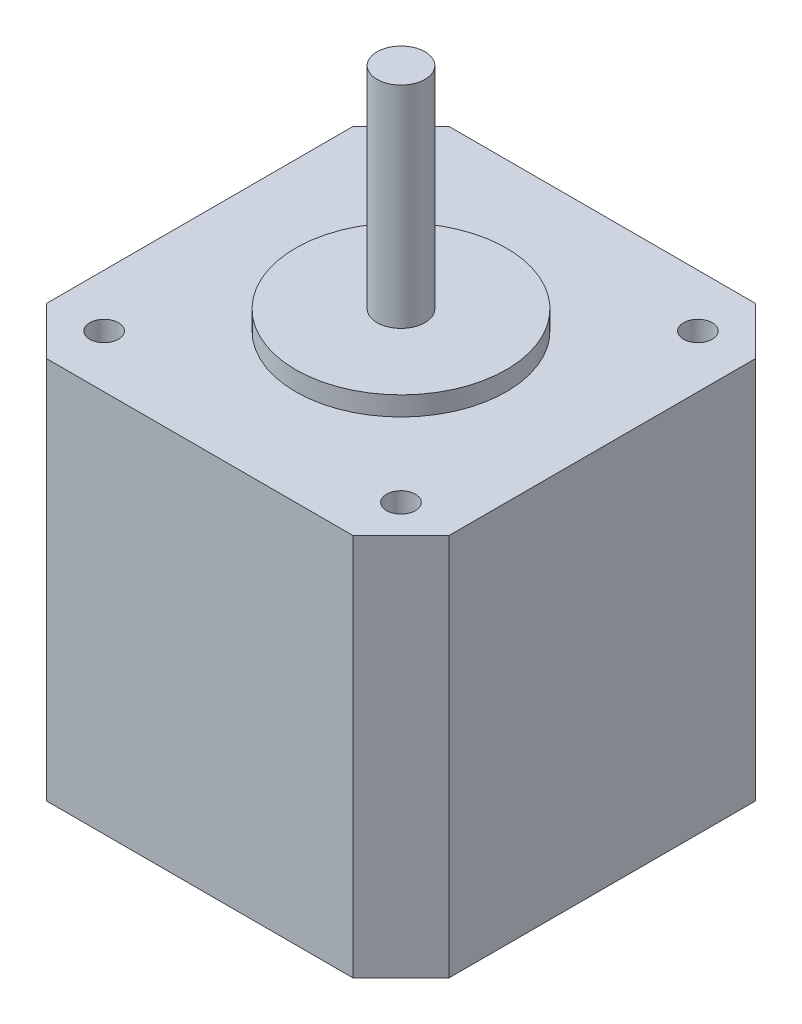
ISO-10303-21;
HEADER;
FILE_DESCRIPTION(('STEP AP214'),'2;1');
FILE_NAME('part.step','',(''),(''),'','','');
FILE_SCHEMA(('AUTOMOTIVE_DESIGN { 1 0 10303 214 1 1 1 1 }'));
ENDSEC;
DATA;
#1=APPLICATION_CONTEXT('core data for automotive mechanical design processes');
#2=APPLICATION_PROTOCOL_DEFINITION('international standard','automotive_design',2000,#1);
#3=PRODUCT_CONTEXT('',#1,'mechanical');
#4=PRODUCT('Part','Part','',(#3));
#5=PRODUCT_RELATED_PRODUCT_CATEGORY('part','',(#4));
#6=PRODUCT_DEFINITION_FORMATION('','',#4);
#7=PRODUCT_DEFINITION_CONTEXT('part definition',#1,'design');
#8=PRODUCT_DEFINITION('design','',#6,#7);
#9=PRODUCT_DEFINITION_SHAPE('','',#8);
#10=(LENGTH_UNIT() NAMED_UNIT(*) SI_UNIT(.MILLI.,.METRE.));
#11=(NAMED_UNIT(*) PLANE_ANGLE_UNIT() SI_UNIT($,.RADIAN.));
#12=(NAMED_UNIT(*) SI_UNIT($,.STERADIAN.) SOLID_ANGLE_UNIT());
#13=UNCERTAINTY_MEASURE_WITH_UNIT(LENGTH_MEASURE(1.E-05),#10,'distance_accuracy_value','');
#14=(GEOMETRIC_REPRESENTATION_CONTEXT(3) GLOBAL_UNCERTAINTY_ASSIGNED_CONTEXT((#13)) GLOBAL_UNIT_ASSIGNED_CONTEXT((#10,
#11,#12)) REPRESENTATION_CONTEXT('',''));
#15=CARTESIAN_POINT('',(0.,0.,0.));
#16=DIRECTION('',(0.,0.,1.));
#17=DIRECTION('',(1.,0.,0.));
#18=AXIS2_PLACEMENT_3D('',#15,#16,#17);
#19=CARTESIAN_POINT('',(-21.,40.,-21.));
#20=DIRECTION('',(1.,0.,0.));
#21=DIRECTION('',(0.,0.,-1.));
#22=AXIS2_PLACEMENT_3D('',#19,#20,#21);
#23=PLANE('',#22);
#24=DIRECTION('',(0.,-1.,0.));
#25=VECTOR('',#24,1.);
#26=CARTESIAN_POINT('',(-21.,2.11607597920603,-8.21099938016574));
#27=LINE('',#26,#25);
#28=CARTESIAN_POINT('',(-21.,2.11607597920603,-8.21099938016574));
#29=VERTEX_POINT('',#28);
#30=CARTESIAN_POINT('',(-21.,0.,-8.21099938016575));
#31=VERTEX_POINT('',#30);
#32=EDGE_CURVE('E57',#29,#31,#27,.T.);
#33=ORIENTED_EDGE('',*,*,#32,.F.);
#34=DIRECTION('',(0.,0.,-1.));
#35=VECTOR('',#34,1.);
#36=CARTESIAN_POINT('',(-21.,2.11607597920603,-8.21099938016574));
#37=LINE('',#36,#35);
#38=CARTESIAN_POINT('',(-21.,2.11607597920603,8.21099938016574));
#39=VERTEX_POINT('',#38);
#40=EDGE_CURVE('E153',#39,#29,#37,.T.);
#41=ORIENTED_EDGE('',*,*,#40,.F.);
#42=DIRECTION('',(0.,1.,0.));
#43=VECTOR('',#42,1.);
#44=CARTESIAN_POINT('',(-21.,2.11607597920603,8.21099938016574));
#45=LINE('',#44,#43);
#46=CARTESIAN_POINT('',(-21.,0.,8.21099938016574));
#47=VERTEX_POINT('',#46);
#48=EDGE_CURVE('E63',#47,#39,#45,.T.);
#49=ORIENTED_EDGE('',*,*,#48,.F.);
#50=DIRECTION('',(0.,0.,1.));
#51=VECTOR('',#50,1.);
#52=CARTESIAN_POINT('',(-21.,0.,-21.));
#53=LINE('',#52,#51);
#54=CARTESIAN_POINT('',(-21.,0.,16.));
#55=VERTEX_POINT('',#54);
#56=EDGE_CURVE('E237',#47,#55,#53,.T.);
#57=ORIENTED_EDGE('',*,*,#56,.T.);
#58=DIRECTION('',(0.,1.,0.));
#59=VECTOR('',#58,1.);
#60=CARTESIAN_POINT('',(-21.,40.,16.));
#61=LINE('',#60,#59);
#62=CARTESIAN_POINT('',(-21.,40.,16.));
#63=VERTEX_POINT('',#62);
#64=EDGE_CURVE('E267',#55,#63,#61,.T.);
#65=ORIENTED_EDGE('',*,*,#64,.T.);
#66=DIRECTION('',(0.,0.,1.));
#67=VECTOR('',#66,1.);
#68=CARTESIAN_POINT('',(-21.,40.,-21.));
#69=LINE('',#68,#67);
#70=CARTESIAN_POINT('',(-21.,40.,-16.));
#71=VERTEX_POINT('',#70);
#72=EDGE_CURVE('E223',#71,#63,#69,.T.);
#73=ORIENTED_EDGE('',*,*,#72,.F.);
#74=DIRECTION('',(0.,-1.,0.));
#75=VECTOR('',#74,1.);
#76=CARTESIAN_POINT('',(-21.,40.,-16.));
#77=LINE('',#76,#75);
#78=CARTESIAN_POINT('',(-21.,0.,-16.));
#79=VERTEX_POINT('',#78);
#80=EDGE_CURVE('E263',#71,#79,#77,.T.);
#81=ORIENTED_EDGE('',*,*,#80,.T.);
#82=EDGE_CURVE('E238',#79,#31,#53,.T.);
#83=ORIENTED_EDGE('',*,*,#82,.T.);
#84=EDGE_LOOP('',(#33,#41,#49,#57,#65,#73,#81,#83));
#85=FACE_BOUND('',#84,.T.);
#86=ADVANCED_FACE('F41',(#85),#23,.F.);
#87=CARTESIAN_POINT('',(21.,40.,-21.));
#88=DIRECTION('',(-1.,0.,0.));
#89=DIRECTION('',(0.,0.,1.));
#90=AXIS2_PLACEMENT_3D('',#87,#88,#89);
#91=PLANE('',#90);
#92=DIRECTION('',(0.,0.,-1.));
#93=VECTOR('',#92,1.);
#94=CARTESIAN_POINT('',(21.,40.,-21.));
#95=LINE('',#94,#93);
#96=CARTESIAN_POINT('',(21.,40.,16.));
#97=VERTEX_POINT('',#96);
#98=CARTESIAN_POINT('',(21.,40.,-16.));
#99=VERTEX_POINT('',#98);
#100=EDGE_CURVE('E214',#97,#99,#95,.T.);
#101=ORIENTED_EDGE('',*,*,#100,.F.);
#102=DIRECTION('',(0.,-1.,0.));
#103=VECTOR('',#102,1.);
#104=CARTESIAN_POINT('',(21.,40.,16.));
#105=LINE('',#104,#103);
#106=CARTESIAN_POINT('',(21.,0.,16.));
#107=VERTEX_POINT('',#106);
#108=EDGE_CURVE('E285',#97,#107,#105,.T.);
#109=ORIENTED_EDGE('',*,*,#108,.T.);
#110=DIRECTION('',(0.,0.,-1.));
#111=VECTOR('',#110,1.);
#112=CARTESIAN_POINT('',(21.,0.,-21.));
#113=LINE('',#112,#111);
#114=CARTESIAN_POINT('',(21.,0.,-16.));
#115=VERTEX_POINT('',#114);
#116=EDGE_CURVE('E209',#107,#115,#113,.T.);
#117=ORIENTED_EDGE('',*,*,#116,.T.);
#118=DIRECTION('',(0.,1.,0.));
#119=VECTOR('',#118,1.);
#120=CARTESIAN_POINT('',(21.,40.,-16.));
#121=LINE('',#120,#119);
#122=EDGE_CURVE('E282',#115,#99,#121,.T.);
#123=ORIENTED_EDGE('',*,*,#122,.T.);
#124=EDGE_LOOP('',(#101,#109,#117,#123));
#125=FACE_BOUND('',#124,.T.);
#126=ADVANCED_FACE('F307',(#125),#91,.F.);
#127=CARTESIAN_POINT('',(-21.,40.,-21.));
#128=DIRECTION('',(0.,0.,1.));
#129=DIRECTION('',(1.,0.,0.));
#130=AXIS2_PLACEMENT_3D('',#127,#128,#129);
#131=PLANE('',#130);
#132=DIRECTION('',(-1.,0.,0.));
#133=VECTOR('',#132,1.);
#134=CARTESIAN_POINT('',(-21.,40.,-21.));
#135=LINE('',#134,#133);
#136=CARTESIAN_POINT('',(16.,40.,-21.));
#137=VERTEX_POINT('',#136);
#138=CARTESIAN_POINT('',(-16.,40.,-21.));
#139=VERTEX_POINT('',#138);
#140=EDGE_CURVE('E218',#137,#139,#135,.T.);
#141=ORIENTED_EDGE('',*,*,#140,.F.);
#142=DIRECTION('',(0.,-1.,0.));
#143=VECTOR('',#142,1.);
#144=CARTESIAN_POINT('',(16.,40.,-21.));
#145=LINE('',#144,#143);
#146=CARTESIAN_POINT('',(16.,0.,-21.));
#147=VERTEX_POINT('',#146);
#148=EDGE_CURVE('E11',#137,#147,#145,.T.);
#149=ORIENTED_EDGE('',*,*,#148,.T.);
#150=DIRECTION('',(-1.,0.,0.));
#151=VECTOR('',#150,1.);
#152=CARTESIAN_POINT('',(-21.,0.,-21.));
#153=LINE('',#152,#151);
#154=CARTESIAN_POINT('',(-16.,0.,-21.));
#155=VERTEX_POINT('',#154);
#156=EDGE_CURVE('E233',#147,#155,#153,.T.);
#157=ORIENTED_EDGE('',*,*,#156,.T.);
#158=DIRECTION('',(0.,1.,0.));
#159=VECTOR('',#158,1.);
#160=CARTESIAN_POINT('',(-16.,40.,-21.));
#161=LINE('',#160,#159);
#162=EDGE_CURVE('E50',#155,#139,#161,.T.);
#163=ORIENTED_EDGE('',*,*,#162,.T.);
#164=EDGE_LOOP('',(#141,#149,#157,#163));
#165=FACE_BOUND('',#164,.T.);
#166=ADVANCED_FACE('F292',(#165),#131,.F.);
#167=CARTESIAN_POINT('',(-21.,40.,21.));
#168=DIRECTION('',(0.,0.,-1.));
#169=DIRECTION('',(-1.,0.,0.));
#170=AXIS2_PLACEMENT_3D('',#167,#168,#169);
#171=PLANE('',#170);
#172=DIRECTION('',(1.,0.,0.));
#173=VECTOR('',#172,1.);
#174=CARTESIAN_POINT('',(-21.,40.,21.));
#175=LINE('',#174,#173);
#176=CARTESIAN_POINT('',(-16.,40.,21.));
#177=VERTEX_POINT('',#176);
#178=CARTESIAN_POINT('',(16.,40.,21.));
#179=VERTEX_POINT('',#178);
#180=EDGE_CURVE('E213',#177,#179,#175,.T.);
#181=ORIENTED_EDGE('',*,*,#180,.F.);
#182=DIRECTION('',(0.,-1.,0.));
#183=VECTOR('',#182,1.);
#184=CARTESIAN_POINT('',(-16.,40.,21.));
#185=LINE('',#184,#183);
#186=CARTESIAN_POINT('',(-16.,0.,21.));
#187=VERTEX_POINT('',#186);
#188=EDGE_CURVE('E246',#177,#187,#185,.T.);
#189=ORIENTED_EDGE('',*,*,#188,.T.);
#190=DIRECTION('',(1.,0.,0.));
#191=VECTOR('',#190,1.);
#192=CARTESIAN_POINT('',(-21.,0.,21.));
#193=LINE('',#192,#191);
#194=CARTESIAN_POINT('',(16.,0.,21.));
#195=VERTEX_POINT('',#194);
#196=EDGE_CURVE('E219',#187,#195,#193,.T.);
#197=ORIENTED_EDGE('',*,*,#196,.T.);
#198=DIRECTION('',(0.,1.,0.));
#199=VECTOR('',#198,1.);
#200=CARTESIAN_POINT('',(16.,40.,21.));
#201=LINE('',#200,#199);
#202=EDGE_CURVE('E204',#195,#179,#201,.T.);
#203=ORIENTED_EDGE('',*,*,#202,.T.);
#204=EDGE_LOOP('',(#181,#189,#197,#203));
#205=FACE_BOUND('',#204,.T.);
#206=ADVANCED_FACE('F327',(#205),#171,.F.);
#207=CARTESIAN_POINT('',(0.,40.,0.));
#208=DIRECTION('',(0.,1.,0.));
#209=DIRECTION('',(0.,0.,1.));
#210=AXIS2_PLACEMENT_3D('',#207,#208,#209);
#211=PLANE('',#210);
#212=CARTESIAN_POINT('',(-15.5,40.,15.5));
#213=DIRECTION('',(0.,1.,0.));
#214=DIRECTION('',(0.,0.,1.));
#215=AXIS2_PLACEMENT_3D('',#212,#213,#214);
#216=CIRCLE('',#215,1.5);
#217=CARTESIAN_POINT('',(-15.5,40.,17.));
#218=VERTEX_POINT('',#217);
#219=EDGE_CURVE('E157',#218,#218,#216,.T.);
#220=ORIENTED_EDGE('',*,*,#219,.F.);
#221=EDGE_LOOP('',(#220));
#222=FACE_BOUND('',#221,.T.);
#223=CARTESIAN_POINT('',(15.5,40.,15.5));
#224=DIRECTION('',(0.,1.,0.));
#225=DIRECTION('',(0.,0.,1.));
#226=AXIS2_PLACEMENT_3D('',#223,#224,#225);
#227=CIRCLE('',#226,1.5);
#228=CARTESIAN_POINT('',(15.5,40.,17.));
#229=VERTEX_POINT('',#228);
#230=EDGE_CURVE('E181',#229,#229,#227,.T.);
#231=ORIENTED_EDGE('',*,*,#230,.F.);
#232=EDGE_LOOP('',(#231));
#233=FACE_BOUND('',#232,.T.);
#234=CARTESIAN_POINT('',(15.5,40.,-15.5));
#235=DIRECTION('',(0.,1.,0.));
#236=DIRECTION('',(0.,0.,1.));
#237=AXIS2_PLACEMENT_3D('',#234,#235,#236);
#238=CIRCLE('',#237,1.5);
#239=CARTESIAN_POINT('',(15.5,40.,-14.));
#240=VERTEX_POINT('',#239);
#241=EDGE_CURVE('E173',#240,#240,#238,.T.);
#242=ORIENTED_EDGE('',*,*,#241,.F.);
#243=EDGE_LOOP('',(#242));
#244=FACE_BOUND('',#243,.T.);
#245=CARTESIAN_POINT('',(-15.5,40.,-15.5));
#246=DIRECTION('',(0.,1.,0.));
#247=DIRECTION('',(0.,0.,1.));
#248=AXIS2_PLACEMENT_3D('',#245,#246,#247);
#249=CIRCLE('',#248,1.5);
#250=CARTESIAN_POINT('',(-15.5,40.,-14.));
#251=VERTEX_POINT('',#250);
#252=EDGE_CURVE('E172',#251,#251,#249,.T.);
#253=ORIENTED_EDGE('',*,*,#252,.F.);
#254=EDGE_LOOP('',(#253));
#255=FACE_BOUND('',#254,.T.);
#256=CARTESIAN_POINT('',(0.,40.,0.));
#257=DIRECTION('',(0.,1.,0.));
#258=DIRECTION('',(0.,0.,1.));
#259=AXIS2_PLACEMENT_3D('',#256,#257,#258);
#260=CIRCLE('',#259,11.);
#261=CARTESIAN_POINT('',(0.,40.,11.));
#262=VERTEX_POINT('',#261);
#263=EDGE_CURVE('E205',#262,#262,#260,.T.);
#264=ORIENTED_EDGE('',*,*,#263,.F.);
#265=EDGE_LOOP('',(#264));
#266=FACE_BOUND('',#265,.T.);
#267=ORIENTED_EDGE('',*,*,#72,.T.);
#268=DIRECTION('',(-0.707106781186547,0.,-0.707106781186548));
#269=VECTOR('',#268,1.);
#270=CARTESIAN_POINT('',(-18.5,40.,18.5));
#271=LINE('',#270,#269);
#272=EDGE_CURVE('E279',#63,#177,#271,.F.);
#273=ORIENTED_EDGE('',*,*,#272,.T.);
#274=ORIENTED_EDGE('',*,*,#180,.T.);
#275=DIRECTION('',(-0.707106781186548,0.,0.707106781186547));
#276=VECTOR('',#275,1.);
#277=CARTESIAN_POINT('',(18.5,40.,18.5));
#278=LINE('',#277,#276);
#279=EDGE_CURVE('E276',#179,#97,#278,.F.);
#280=ORIENTED_EDGE('',*,*,#279,.T.);
#281=ORIENTED_EDGE('',*,*,#100,.T.);
#282=DIRECTION('',(0.707106781186547,0.,0.707106781186548));
#283=VECTOR('',#282,1.);
#284=CARTESIAN_POINT('',(18.5,40.,-18.5));
#285=LINE('',#284,#283);
#286=EDGE_CURVE('E273',#99,#137,#285,.F.);
#287=ORIENTED_EDGE('',*,*,#286,.T.);
#288=ORIENTED_EDGE('',*,*,#140,.T.);
#289=DIRECTION('',(0.707106781186548,0.,-0.707106781186547));
#290=VECTOR('',#289,1.);
#291=CARTESIAN_POINT('',(-18.5,40.,-18.5));
#292=LINE('',#291,#290);
#293=EDGE_CURVE('E270',#139,#71,#292,.F.);
#294=ORIENTED_EDGE('',*,*,#293,.T.);
#295=EDGE_LOOP('',(#267,#273,#274,#280,#281,#287,#288,#294));
#296=FACE_BOUND('',#295,.T.);
#297=ADVANCED_FACE('F298',(#222,#233,#244,#255,#266,#296),#211,.T.);
#298=CARTESIAN_POINT('',(0.,0.,0.));
#299=DIRECTION('',(0.,1.,0.));
#300=DIRECTION('',(0.,0.,1.));
#301=AXIS2_PLACEMENT_3D('',#298,#299,#300);
#302=PLANE('',#301);
#303=ORIENTED_EDGE('',*,*,#196,.F.);
#304=DIRECTION('',(0.707106781186547,0.,0.707106781186548));
#305=VECTOR('',#304,1.);
#306=CARTESIAN_POINT('',(-16.,0.,21.));
#307=LINE('',#306,#305);
#308=EDGE_CURVE('E259',#187,#55,#307,.F.);
#309=ORIENTED_EDGE('',*,*,#308,.T.);
#310=ORIENTED_EDGE('',*,*,#56,.F.);
#311=DIRECTION('',(1.,0.,0.));
#312=VECTOR('',#311,1.);
#313=CARTESIAN_POINT('',(-28.,0.,8.21099938016574));
#314=LINE('',#313,#312);
#315=CARTESIAN_POINT('',(-28.,0.,8.21099938016574));
#316=VERTEX_POINT('',#315);
#317=EDGE_CURVE('E138',#316,#47,#314,.T.);
#318=ORIENTED_EDGE('',*,*,#317,.F.);
#319=DIRECTION('',(0.,0.,1.));
#320=VECTOR('',#319,1.);
#321=CARTESIAN_POINT('',(-28.,0.,-8.21099938016574));
#322=LINE('',#321,#320);
#323=CARTESIAN_POINT('',(-28.,0.,-8.21099938016574));
#324=VERTEX_POINT('',#323);
#325=EDGE_CURVE('E130',#324,#316,#322,.T.);
#326=ORIENTED_EDGE('',*,*,#325,.F.);
#327=DIRECTION('',(1.,0.,0.));
#328=VECTOR('',#327,1.);
#329=CARTESIAN_POINT('',(-28.,0.,-8.21099938016574));
#330=LINE('',#329,#328);
#331=EDGE_CURVE('E136',#324,#31,#330,.T.);
#332=ORIENTED_EDGE('',*,*,#331,.T.);
#333=ORIENTED_EDGE('',*,*,#82,.F.);
#334=DIRECTION('',(-0.707106781186548,0.,0.707106781186547));
#335=VECTOR('',#334,1.);
#336=CARTESIAN_POINT('',(-21.,0.,-16.));
#337=LINE('',#336,#335);
#338=EDGE_CURVE('E250',#79,#155,#337,.F.);
#339=ORIENTED_EDGE('',*,*,#338,.T.);
#340=ORIENTED_EDGE('',*,*,#156,.F.);
#341=DIRECTION('',(-0.707106781186547,0.,-0.707106781186548));
#342=VECTOR('',#341,1.);
#343=CARTESIAN_POINT('',(16.,0.,-21.));
#344=LINE('',#343,#342);
#345=EDGE_CURVE('E253',#147,#115,#344,.F.);
#346=ORIENTED_EDGE('',*,*,#345,.T.);
#347=ORIENTED_EDGE('',*,*,#116,.F.);
#348=DIRECTION('',(0.707106781186548,0.,-0.707106781186547));
#349=VECTOR('',#348,1.);
#350=CARTESIAN_POINT('',(21.,0.,16.));
#351=LINE('',#350,#349);
#352=EDGE_CURVE('E256',#107,#195,#351,.F.);
#353=ORIENTED_EDGE('',*,*,#352,.T.);
#354=EDGE_LOOP('',(#303,#309,#310,#318,#326,#332,#333,#339,#340,#346,#347,#353));
#355=FACE_BOUND('',#354,.T.);
#356=ADVANCED_FACE('F133',(#355),#302,.F.);
#357=CARTESIAN_POINT('',(0.,42.,0.));
#358=DIRECTION('',(0.,-1.,0.));
#359=DIRECTION('',(0.,0.,-1.));
#360=AXIS2_PLACEMENT_3D('',#357,#358,#359);
#361=CYLINDRICAL_SURFACE('',#360,11.);
#362=CARTESIAN_POINT('',(0.,42.,0.));
#363=DIRECTION('',(0.,1.,0.));
#364=DIRECTION('',(0.,0.,1.));
#365=AXIS2_PLACEMENT_3D('',#362,#363,#364);
#366=CIRCLE('',#365,11.);
#367=CARTESIAN_POINT('',(0.,42.,11.));
#368=VERTEX_POINT('',#367);
#369=EDGE_CURVE('E199',#368,#368,#366,.T.);
#370=ORIENTED_EDGE('',*,*,#369,.F.);
#371=EDGE_LOOP('',(#370));
#372=FACE_BOUND('',#371,.T.);
#373=ORIENTED_EDGE('',*,*,#263,.T.);
#374=EDGE_LOOP('',(#373));
#375=FACE_BOUND('',#374,.T.);
#376=ADVANCED_FACE('F417',(#372,#375),#361,.T.);
#377=CARTESIAN_POINT('',(0.,42.,0.));
#378=DIRECTION('',(0.,1.,0.));
#379=DIRECTION('',(0.,0.,1.));
#380=AXIS2_PLACEMENT_3D('',#377,#378,#379);
#381=PLANE('',#380);
#382=CARTESIAN_POINT('',(0.,42.,0.));
#383=DIRECTION('',(0.,1.,0.));
#384=DIRECTION('',(0.,0.,1.));
#385=AXIS2_PLACEMENT_3D('',#382,#383,#384);
#386=CIRCLE('',#385,2.5);
#387=CARTESIAN_POINT('',(0.,42.,2.5));
#388=VERTEX_POINT('',#387);
#389=EDGE_CURVE('E200',#388,#388,#386,.T.);
#390=ORIENTED_EDGE('',*,*,#389,.F.);
#391=EDGE_LOOP('',(#390));
#392=FACE_BOUND('',#391,.T.);
#393=ORIENTED_EDGE('',*,*,#369,.T.);
#394=EDGE_LOOP('',(#393));
#395=FACE_BOUND('',#394,.T.);
#396=ADVANCED_FACE('F413',(#392,#395),#381,.T.);
#397=CARTESIAN_POINT('',(0.,64.,0.));
#398=DIRECTION('',(0.,-1.,0.));
#399=DIRECTION('',(0.,0.,-1.));
#400=AXIS2_PLACEMENT_3D('',#397,#398,#399);
#401=CYLINDRICAL_SURFACE('',#400,2.5);
#402=CARTESIAN_POINT('',(0.,64.,0.));
#403=DIRECTION('',(0.,1.,0.));
#404=DIRECTION('',(0.,0.,1.));
#405=AXIS2_PLACEMENT_3D('',#402,#403,#404);
#406=CIRCLE('',#405,2.5);
#407=CARTESIAN_POINT('',(0.,64.,2.5));
#408=VERTEX_POINT('',#407);
#409=EDGE_CURVE('E192',#408,#408,#406,.T.);
#410=ORIENTED_EDGE('',*,*,#409,.F.);
#411=EDGE_LOOP('',(#410));
#412=FACE_BOUND('',#411,.T.);
#413=ORIENTED_EDGE('',*,*,#389,.T.);
#414=EDGE_LOOP('',(#413));
#415=FACE_BOUND('',#414,.T.);
#416=ADVANCED_FACE('F409',(#412,#415),#401,.T.);
#417=CARTESIAN_POINT('',(0.,64.,0.));
#418=DIRECTION('',(0.,1.,0.));
#419=DIRECTION('',(0.,0.,1.));
#420=AXIS2_PLACEMENT_3D('',#417,#418,#419);
#421=PLANE('',#420);
#422=ORIENTED_EDGE('',*,*,#409,.T.);
#423=EDGE_LOOP('',(#422));
#424=FACE_BOUND('',#423,.T.);
#425=ADVANCED_FACE('F405',(#424),#421,.T.);
#426=CARTESIAN_POINT('',(-15.5,35.5,-15.5));
#427=DIRECTION('',(0.,1.,0.));
#428=DIRECTION('',(0.,0.,1.));
#429=AXIS2_PLACEMENT_3D('',#426,#427,#428);
#430=CYLINDRICAL_SURFACE('',#429,1.5);
#431=CARTESIAN_POINT('',(-15.5,35.5,-15.5));
#432=DIRECTION('',(0.,1.,0.));
#433=DIRECTION('',(0.,0.,1.));
#434=AXIS2_PLACEMENT_3D('',#431,#432,#433);
#435=CIRCLE('',#434,1.5);
#436=CARTESIAN_POINT('',(-15.5,35.5,-14.));
#437=VERTEX_POINT('',#436);
#438=EDGE_CURVE('E188',#437,#437,#435,.T.);
#439=ORIENTED_EDGE('',*,*,#438,.F.);
#440=EDGE_LOOP('',(#439));
#441=FACE_BOUND('',#440,.T.);
#442=ORIENTED_EDGE('',*,*,#252,.T.);
#443=EDGE_LOOP('',(#442));
#444=FACE_BOUND('',#443,.T.);
#445=ADVANCED_FACE('F401',(#441,#444),#430,.F.);
#446=CARTESIAN_POINT('',(-15.5,35.5,-15.5));
#447=DIRECTION('',(0.,1.,0.));
#448=DIRECTION('',(0.,0.,1.));
#449=AXIS2_PLACEMENT_3D('',#446,#447,#448);
#450=PLANE('',#449);
#451=ORIENTED_EDGE('',*,*,#438,.T.);
#452=EDGE_LOOP('',(#451));
#453=FACE_BOUND('',#452,.T.);
#454=ADVANCED_FACE('F387',(#453),#450,.T.);
#455=CARTESIAN_POINT('',(15.5,35.5,-15.5));
#456=DIRECTION('',(0.,1.,0.));
#457=DIRECTION('',(0.,0.,1.));
#458=AXIS2_PLACEMENT_3D('',#455,#456,#457);
#459=CYLINDRICAL_SURFACE('',#458,1.5);
#460=CARTESIAN_POINT('',(15.5,35.5,-15.5));
#461=DIRECTION('',(0.,1.,0.));
#462=DIRECTION('',(0.,0.,1.));
#463=AXIS2_PLACEMENT_3D('',#460,#461,#462);
#464=CIRCLE('',#463,1.5);
#465=CARTESIAN_POINT('',(15.5,35.5,-14.));
#466=VERTEX_POINT('',#465);
#467=EDGE_CURVE('E168',#466,#466,#464,.T.);
#468=ORIENTED_EDGE('',*,*,#467,.F.);
#469=EDGE_LOOP('',(#468));
#470=FACE_BOUND('',#469,.T.);
#471=ORIENTED_EDGE('',*,*,#241,.T.);
#472=EDGE_LOOP('',(#471));
#473=FACE_BOUND('',#472,.T.);
#474=ADVANCED_FACE('F383',(#470,#473),#459,.F.);
#475=CARTESIAN_POINT('',(15.5,35.5,-15.5));
#476=DIRECTION('',(0.,1.,0.));
#477=DIRECTION('',(0.,0.,1.));
#478=AXIS2_PLACEMENT_3D('',#475,#476,#477);
#479=PLANE('',#478);
#480=ORIENTED_EDGE('',*,*,#467,.T.);
#481=EDGE_LOOP('',(#480));
#482=FACE_BOUND('',#481,.T.);
#483=ADVANCED_FACE('F379',(#482),#479,.T.);
#484=CARTESIAN_POINT('',(15.5,35.5,15.5));
#485=DIRECTION('',(0.,1.,0.));
#486=DIRECTION('',(0.,0.,1.));
#487=AXIS2_PLACEMENT_3D('',#484,#485,#486);
#488=CYLINDRICAL_SURFACE('',#487,1.5);
#489=CARTESIAN_POINT('',(15.5,35.5,15.5));
#490=DIRECTION('',(0.,1.,0.));
#491=DIRECTION('',(0.,0.,1.));
#492=AXIS2_PLACEMENT_3D('',#489,#490,#491);
#493=CIRCLE('',#492,1.5);
#494=CARTESIAN_POINT('',(15.5,35.5,17.));
#495=VERTEX_POINT('',#494);
#496=EDGE_CURVE('E177',#495,#495,#493,.T.);
#497=ORIENTED_EDGE('',*,*,#496,.F.);
#498=EDGE_LOOP('',(#497));
#499=FACE_BOUND('',#498,.T.);
#500=ORIENTED_EDGE('',*,*,#230,.T.);
#501=EDGE_LOOP('',(#500));
#502=FACE_BOUND('',#501,.T.);
#503=ADVANCED_FACE('F382',(#499,#502),#488,.F.);
#504=CARTESIAN_POINT('',(15.5,35.5,15.5));
#505=DIRECTION('',(0.,1.,0.));
#506=DIRECTION('',(0.,0.,1.));
#507=AXIS2_PLACEMENT_3D('',#504,#505,#506);
#508=PLANE('',#507);
#509=ORIENTED_EDGE('',*,*,#496,.T.);
#510=EDGE_LOOP('',(#509));
#511=FACE_BOUND('',#510,.T.);
#512=ADVANCED_FACE('F389',(#511),#508,.T.);
#513=CARTESIAN_POINT('',(-15.5,35.5,15.5));
#514=DIRECTION('',(0.,1.,0.));
#515=DIRECTION('',(0.,0.,1.));
#516=AXIS2_PLACEMENT_3D('',#513,#514,#515);
#517=CYLINDRICAL_SURFACE('',#516,1.5);
#518=CARTESIAN_POINT('',(-15.5,35.5,15.5));
#519=DIRECTION('',(0.,1.,0.));
#520=DIRECTION('',(0.,0.,1.));
#521=AXIS2_PLACEMENT_3D('',#518,#519,#520);
#522=CIRCLE('',#521,1.5);
#523=CARTESIAN_POINT('',(-15.5,35.5,17.));
#524=VERTEX_POINT('',#523);
#525=EDGE_CURVE('E162',#524,#524,#522,.T.);
#526=ORIENTED_EDGE('',*,*,#525,.F.);
#527=EDGE_LOOP('',(#526));
#528=FACE_BOUND('',#527,.T.);
#529=ORIENTED_EDGE('',*,*,#219,.T.);
#530=EDGE_LOOP('',(#529));
#531=FACE_BOUND('',#530,.T.);
#532=ADVANCED_FACE('F337',(#528,#531),#517,.F.);
#533=CARTESIAN_POINT('',(-15.5,35.5,15.5));
#534=DIRECTION('',(0.,1.,0.));
#535=DIRECTION('',(0.,0.,1.));
#536=AXIS2_PLACEMENT_3D('',#533,#534,#535);
#537=PLANE('',#536);
#538=ORIENTED_EDGE('',*,*,#525,.T.);
#539=EDGE_LOOP('',(#538));
#540=FACE_BOUND('',#539,.T.);
#541=ADVANCED_FACE('F332',(#540),#537,.T.);
#542=CARTESIAN_POINT('',(-16.,40.,21.));
#543=DIRECTION('',(0.707106781186548,0.,-0.707106781186547));
#544=DIRECTION('',(0.,-1.,0.));
#545=AXIS2_PLACEMENT_3D('',#542,#543,#544);
#546=PLANE('',#545);
#547=ORIENTED_EDGE('',*,*,#272,.F.);
#548=ORIENTED_EDGE('',*,*,#64,.F.);
#549=ORIENTED_EDGE('',*,*,#308,.F.);
#550=ORIENTED_EDGE('',*,*,#188,.F.);
#551=EDGE_LOOP('',(#547,#548,#549,#550));
#552=FACE_BOUND('',#551,.T.);
#553=ADVANCED_FACE('F316',(#552),#546,.F.);
#554=CARTESIAN_POINT('',(21.,40.,16.));
#555=DIRECTION('',(-0.707106781186547,0.,-0.707106781186548));
#556=DIRECTION('',(0.,-1.,0.));
#557=AXIS2_PLACEMENT_3D('',#554,#555,#556);
#558=PLANE('',#557);
#559=ORIENTED_EDGE('',*,*,#279,.F.);
#560=ORIENTED_EDGE('',*,*,#202,.F.);
#561=ORIENTED_EDGE('',*,*,#352,.F.);
#562=ORIENTED_EDGE('',*,*,#108,.F.);
#563=EDGE_LOOP('',(#559,#560,#561,#562));
#564=FACE_BOUND('',#563,.T.);
#565=ADVANCED_FACE('F311',(#564),#558,.F.);
#566=CARTESIAN_POINT('',(16.,40.,-21.));
#567=DIRECTION('',(-0.707106781186548,0.,0.707106781186547));
#568=DIRECTION('',(0.,-1.,0.));
#569=AXIS2_PLACEMENT_3D('',#566,#567,#568);
#570=PLANE('',#569);
#571=ORIENTED_EDGE('',*,*,#286,.F.);
#572=ORIENTED_EDGE('',*,*,#122,.F.);
#573=ORIENTED_EDGE('',*,*,#345,.F.);
#574=ORIENTED_EDGE('',*,*,#148,.F.);
#575=EDGE_LOOP('',(#571,#572,#573,#574));
#576=FACE_BOUND('',#575,.T.);
#577=ADVANCED_FACE('F309',(#576),#570,.F.);
#578=CARTESIAN_POINT('',(-21.,40.,-16.));
#579=DIRECTION('',(0.707106781186547,0.,0.707106781186548));
#580=DIRECTION('',(0.,-1.,0.));
#581=AXIS2_PLACEMENT_3D('',#578,#579,#580);
#582=PLANE('',#581);
#583=ORIENTED_EDGE('',*,*,#293,.F.);
#584=ORIENTED_EDGE('',*,*,#162,.F.);
#585=ORIENTED_EDGE('',*,*,#338,.F.);
#586=ORIENTED_EDGE('',*,*,#80,.F.);
#587=EDGE_LOOP('',(#583,#584,#585,#586));
#588=FACE_BOUND('',#587,.T.);
#589=ADVANCED_FACE('F43',(#588),#582,.F.);
#590=CARTESIAN_POINT('',(-28.,2.11607597920603,-8.21099938016574));
#591=DIRECTION('',(0.,0.,1.));
#592=DIRECTION('',(1.,0.,0.));
#593=AXIS2_PLACEMENT_3D('',#590,#591,#592);
#594=PLANE('',#593);
#595=ORIENTED_EDGE('',*,*,#32,.T.);
#596=ORIENTED_EDGE('',*,*,#331,.F.);
#597=DIRECTION('',(0.,-1.,0.));
#598=VECTOR('',#597,1.);
#599=CARTESIAN_POINT('',(-28.,2.11607597920603,-8.21099938016574));
#600=LINE('',#599,#598);
#601=CARTESIAN_POINT('',(-28.,2.11607597920603,-8.21099938016574));
#602=VERTEX_POINT('',#601);
#603=EDGE_CURVE('E143',#602,#324,#600,.T.);
#604=ORIENTED_EDGE('',*,*,#603,.F.);
#605=DIRECTION('',(1.,0.,0.));
#606=VECTOR('',#605,1.);
#607=CARTESIAN_POINT('',(-28.,2.11607597920603,-8.21099938016574));
#608=LINE('',#607,#606);
#609=EDGE_CURVE('E355',#602,#29,#608,.T.);
#610=ORIENTED_EDGE('',*,*,#609,.T.);
#611=EDGE_LOOP('',(#595,#596,#604,#610));
#612=FACE_BOUND('',#611,.T.);
#613=ADVANCED_FACE('F155',(#612),#594,.F.);
#614=CARTESIAN_POINT('',(-28.,2.11607597920603,8.21099938016574));
#615=DIRECTION('',(0.,0.,-1.));
#616=DIRECTION('',(-1.,0.,0.));
#617=AXIS2_PLACEMENT_3D('',#614,#615,#616);
#618=PLANE('',#617);
#619=ORIENTED_EDGE('',*,*,#48,.T.);
#620=DIRECTION('',(1.,0.,0.));
#621=VECTOR('',#620,1.);
#622=CARTESIAN_POINT('',(-28.,2.11607597920603,8.21099938016574));
#623=LINE('',#622,#621);
#624=CARTESIAN_POINT('',(-28.,2.11607597920603,8.21099938016574));
#625=VERTEX_POINT('',#624);
#626=EDGE_CURVE('E164',#625,#39,#623,.T.);
#627=ORIENTED_EDGE('',*,*,#626,.F.);
#628=DIRECTION('',(0.,1.,0.));
#629=VECTOR('',#628,1.);
#630=CARTESIAN_POINT('',(-28.,2.11607597920603,8.21099938016574));
#631=LINE('',#630,#629);
#632=EDGE_CURVE('E142',#316,#625,#631,.T.);
#633=ORIENTED_EDGE('',*,*,#632,.F.);
#634=ORIENTED_EDGE('',*,*,#317,.T.);
#635=EDGE_LOOP('',(#619,#627,#633,#634));
#636=FACE_BOUND('',#635,.T.);
#637=ADVANCED_FACE('F349',(#636),#618,.F.);
#638=CARTESIAN_POINT('',(-28.,2.11607597920603,-8.21099938016574));
#639=DIRECTION('',(0.,-1.,0.));
#640=DIRECTION('',(0.,0.,-1.));
#641=AXIS2_PLACEMENT_3D('',#638,#639,#640);
#642=PLANE('',#641);
#643=ORIENTED_EDGE('',*,*,#40,.T.);
#644=ORIENTED_EDGE('',*,*,#609,.F.);
#645=DIRECTION('',(0.,0.,-1.));
#646=VECTOR('',#645,1.);
#647=CARTESIAN_POINT('',(-28.,2.11607597920603,-8.21099938016574));
#648=LINE('',#647,#646);
#649=EDGE_CURVE('E148',#625,#602,#648,.T.);
#650=ORIENTED_EDGE('',*,*,#649,.F.);
#651=ORIENTED_EDGE('',*,*,#626,.T.);
#652=EDGE_LOOP('',(#643,#644,#650,#651));
#653=FACE_BOUND('',#652,.T.);
#654=ADVANCED_FACE('F367',(#653),#642,.F.);
#655=CARTESIAN_POINT('',(-28.,0.,0.));
#656=DIRECTION('',(-1.,0.,0.));
#657=DIRECTION('',(0.,0.,1.));
#658=AXIS2_PLACEMENT_3D('',#655,#656,#657);
#659=PLANE('',#658);
#660=ORIENTED_EDGE('',*,*,#603,.T.);
#661=ORIENTED_EDGE('',*,*,#325,.T.);
#662=ORIENTED_EDGE('',*,*,#632,.T.);
#663=ORIENTED_EDGE('',*,*,#649,.T.);
#664=EDGE_LOOP('',(#660,#661,#662,#663));
#665=FACE_BOUND('',#664,.T.);
#666=ADVANCED_FACE('F146',(#665),#659,.T.);
#667=CLOSED_SHELL('',(#86,#126,#166,#206,#297,#356,#376,#396,#416,#425,#445,#454,#474,#483,#503,
#512,#532,#541,#553,#565,#577,#589,#613,#637,#654,#666));
#668=MANIFOLD_SOLID_BREP('B2',#667);
#669=ADVANCED_BREP_SHAPE_REPRESENTATION('',(#18,#668),#14);
#670=SHAPE_DEFINITION_REPRESENTATION(#9,#669);
ENDSEC;
END-ISO-10303-21;
